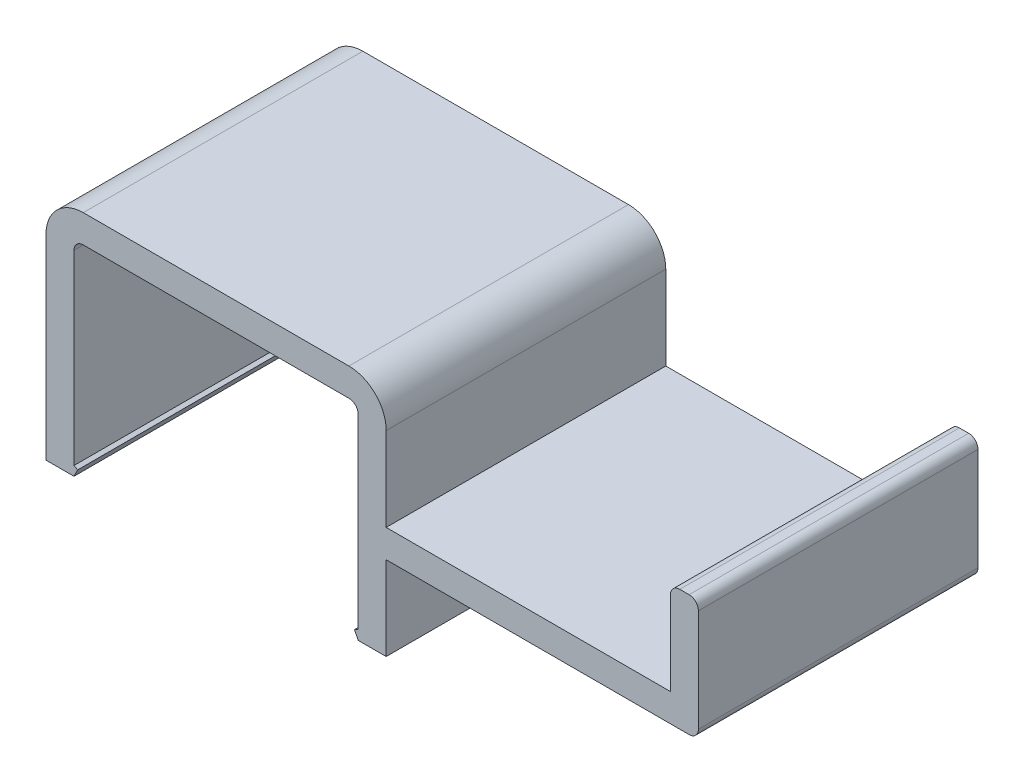
ISO-10303-21;
HEADER;
FILE_DESCRIPTION(('STEP AP214'),'2;1');
FILE_NAME('part.step','',(''),(''),'','','');
FILE_SCHEMA(('AUTOMOTIVE_DESIGN { 1 0 10303 214 1 1 1 1 }'));
ENDSEC;
DATA;
#1=APPLICATION_CONTEXT('core data for automotive mechanical design processes');
#2=APPLICATION_PROTOCOL_DEFINITION('international standard','automotive_design',2000,#1);
#3=PRODUCT_CONTEXT('',#1,'mechanical');
#4=PRODUCT('Part','Part','',(#3));
#5=PRODUCT_RELATED_PRODUCT_CATEGORY('part','',(#4));
#6=PRODUCT_DEFINITION_FORMATION('','',#4);
#7=PRODUCT_DEFINITION_CONTEXT('part definition',#1,'design');
#8=PRODUCT_DEFINITION('design','',#6,#7);
#9=PRODUCT_DEFINITION_SHAPE('','',#8);
#10=(LENGTH_UNIT() NAMED_UNIT(*) SI_UNIT(.MILLI.,.METRE.));
#11=(NAMED_UNIT(*) PLANE_ANGLE_UNIT() SI_UNIT($,.RADIAN.));
#12=(NAMED_UNIT(*) SI_UNIT($,.STERADIAN.) SOLID_ANGLE_UNIT());
#13=UNCERTAINTY_MEASURE_WITH_UNIT(LENGTH_MEASURE(1.E-05),#10,'distance_accuracy_value','');
#14=(GEOMETRIC_REPRESENTATION_CONTEXT(3) GLOBAL_UNCERTAINTY_ASSIGNED_CONTEXT((#13)) GLOBAL_UNIT_ASSIGNED_CONTEXT((#10,
#11,#12)) REPRESENTATION_CONTEXT('',''));
#15=CARTESIAN_POINT('',(0.,0.,0.));
#16=DIRECTION('',(0.,0.,1.));
#17=DIRECTION('',(1.,0.,0.));
#18=AXIS2_PLACEMENT_3D('',#15,#16,#17);
#19=CARTESIAN_POINT('',(18.5,7.5,30.));
#20=DIRECTION('',(-1.,0.,0.));
#21=DIRECTION('',(0.,-1.,0.));
#22=AXIS2_PLACEMENT_3D('',#19,#20,#21);
#23=PLANE('',#22);
#24=DIRECTION('',(0.,0.,-1.));
#25=VECTOR('',#24,1.);
#26=CARTESIAN_POINT('',(18.5,-4.5,30.));
#27=LINE('',#26,#25);
#28=CARTESIAN_POINT('',(18.5,-4.5,30.));
#29=VERTEX_POINT('',#28);
#30=CARTESIAN_POINT('',(18.5,-4.5,0.));
#31=VERTEX_POINT('',#30);
#32=EDGE_CURVE('E64',#29,#31,#27,.T.);
#33=ORIENTED_EDGE('',*,*,#32,.F.);
#34=DIRECTION('',(0.,1.,0.));
#35=VECTOR('',#34,1.);
#36=CARTESIAN_POINT('',(18.5,7.5,30.));
#37=LINE('',#36,#35);
#38=CARTESIAN_POINT('',(18.5,-13.5,30.));
#39=VERTEX_POINT('',#38);
#40=EDGE_CURVE('E353',#39,#29,#37,.T.);
#41=ORIENTED_EDGE('',*,*,#40,.F.);
#42=DIRECTION('',(0.,0.,1.));
#43=VECTOR('',#42,1.);
#44=CARTESIAN_POINT('',(18.5,-13.5,0.));
#45=LINE('',#44,#43);
#46=CARTESIAN_POINT('',(18.5,-13.5,0.));
#47=VERTEX_POINT('',#46);
#48=EDGE_CURVE('E217',#47,#39,#45,.T.);
#49=ORIENTED_EDGE('',*,*,#48,.F.);
#50=DIRECTION('',(0.,1.,0.));
#51=VECTOR('',#50,1.);
#52=CARTESIAN_POINT('',(18.5,7.5,0.));
#53=LINE('',#52,#51);
#54=EDGE_CURVE('E379',#47,#31,#53,.T.);
#55=ORIENTED_EDGE('',*,*,#54,.T.);
#56=EDGE_LOOP('',(#33,#41,#49,#55));
#57=FACE_BOUND('',#56,.T.);
#58=ADVANCED_FACE('F41',(#57),#23,.F.);
#59=CARTESIAN_POINT('',(-18.,7.49999999999999,30.));
#60=DIRECTION('',(1.,0.,0.));
#61=DIRECTION('',(0.,1.,0.));
#62=AXIS2_PLACEMENT_3D('',#59,#60,#61);
#63=PLANE('',#62);
#64=DIRECTION('',(0.,-1.,0.));
#65=VECTOR('',#64,1.);
#66=CARTESIAN_POINT('',(-18.,7.49999999999999,0.));
#67=LINE('',#66,#65);
#68=CARTESIAN_POINT('',(-18.,7.49999999999999,0.));
#69=VERTEX_POINT('',#68);
#70=CARTESIAN_POINT('',(-18.,-13.5,0.));
#71=VERTEX_POINT('',#70);
#72=EDGE_CURVE('E330',#69,#71,#67,.T.);
#73=ORIENTED_EDGE('',*,*,#72,.T.);
#74=DIRECTION('',(0.,0.,1.));
#75=VECTOR('',#74,1.);
#76=CARTESIAN_POINT('',(-18.,-13.5,0.));
#77=LINE('',#76,#75);
#78=CARTESIAN_POINT('',(-18.,-13.5,30.));
#79=VERTEX_POINT('',#78);
#80=EDGE_CURVE('E320',#71,#79,#77,.T.);
#81=ORIENTED_EDGE('',*,*,#80,.T.);
#82=DIRECTION('',(0.,-1.,0.));
#83=VECTOR('',#82,1.);
#84=CARTESIAN_POINT('',(-18.,7.49999999999999,30.));
#85=LINE('',#84,#83);
#86=CARTESIAN_POINT('',(-18.,7.49999999999999,30.));
#87=VERTEX_POINT('',#86);
#88=EDGE_CURVE('E335',#87,#79,#85,.T.);
#89=ORIENTED_EDGE('',*,*,#88,.F.);
#90=DIRECTION('',(0.,0.,-1.));
#91=VECTOR('',#90,1.);
#92=CARTESIAN_POINT('',(-18.,7.49999999999999,30.));
#93=LINE('',#92,#91);
#94=EDGE_CURVE('E361',#87,#69,#93,.T.);
#95=ORIENTED_EDGE('',*,*,#94,.T.);
#96=EDGE_LOOP('',(#73,#81,#89,#95));
#97=FACE_BOUND('',#96,.T.);
#98=ADVANCED_FACE('F43',(#97),#63,.F.);
#99=CARTESIAN_POINT('',(-15.,7.49999999999999,30.));
#100=DIRECTION('',(1.,0.,0.));
#101=DIRECTION('',(0.,1.,0.));
#102=AXIS2_PLACEMENT_3D('',#99,#100,#101);
#103=PLANE('',#102);
#104=DIRECTION('',(0.,-1.,0.));
#105=VECTOR('',#104,1.);
#106=CARTESIAN_POINT('',(-15.,7.49999999999999,0.));
#107=LINE('',#106,#105);
#108=CARTESIAN_POINT('',(-15.,7.49999999999999,0.));
#109=VERTEX_POINT('',#108);
#110=CARTESIAN_POINT('',(-15.,-12.5,0.));
#111=VERTEX_POINT('',#110);
#112=EDGE_CURVE('E363',#109,#111,#107,.T.);
#113=ORIENTED_EDGE('',*,*,#112,.F.);
#114=DIRECTION('',(0.,0.,-1.));
#115=VECTOR('',#114,1.);
#116=CARTESIAN_POINT('',(-15.,7.49999999999999,30.));
#117=LINE('',#116,#115);
#118=CARTESIAN_POINT('',(-15.,7.49999999999999,30.));
#119=VERTEX_POINT('',#118);
#120=EDGE_CURVE('E49',#119,#109,#117,.T.);
#121=ORIENTED_EDGE('',*,*,#120,.F.);
#122=DIRECTION('',(0.,-1.,0.));
#123=VECTOR('',#122,1.);
#124=CARTESIAN_POINT('',(-15.,7.49999999999999,30.));
#125=LINE('',#124,#123);
#126=CARTESIAN_POINT('',(-15.,-12.5,30.));
#127=VERTEX_POINT('',#126);
#128=EDGE_CURVE('E337',#119,#127,#125,.T.);
#129=ORIENTED_EDGE('',*,*,#128,.T.);
#130=DIRECTION('',(0.,0.,-1.));
#131=VECTOR('',#130,1.);
#132=CARTESIAN_POINT('',(-15.,-12.5,30.));
#133=LINE('',#132,#131);
#134=EDGE_CURVE('E11',#127,#111,#133,.T.);
#135=ORIENTED_EDGE('',*,*,#134,.T.);
#136=EDGE_LOOP('',(#113,#121,#129,#135));
#137=FACE_BOUND('',#136,.T.);
#138=ADVANCED_FACE('F412',(#137),#103,.T.);
#139=CARTESIAN_POINT('',(-14.,7.5,30.));
#140=DIRECTION('',(0.,0.,-1.));
#141=DIRECTION('',(-1.,0.,0.));
#142=AXIS2_PLACEMENT_3D('',#139,#140,#141);
#143=CYLINDRICAL_SURFACE('',#142,0.999999999999999);
#144=CARTESIAN_POINT('',(-14.,7.5,0.));
#145=DIRECTION('',(0.,0.,1.));
#146=DIRECTION('',(1.,0.,0.));
#147=AXIS2_PLACEMENT_3D('',#144,#145,#146);
#148=CIRCLE('',#147,0.999999999999999);
#149=CARTESIAN_POINT('',(-14.,8.5,0.));
#150=VERTEX_POINT('',#149);
#151=EDGE_CURVE('E366',#150,#109,#148,.T.);
#152=ORIENTED_EDGE('',*,*,#151,.F.);
#153=DIRECTION('',(0.,0.,-1.));
#154=VECTOR('',#153,1.);
#155=CARTESIAN_POINT('',(-14.,8.5,30.));
#156=LINE('',#155,#154);
#157=CARTESIAN_POINT('',(-14.,8.5,30.));
#158=VERTEX_POINT('',#157);
#159=EDGE_CURVE('E404',#158,#150,#156,.T.);
#160=ORIENTED_EDGE('',*,*,#159,.F.);
#161=CARTESIAN_POINT('',(-14.,7.5,30.));
#162=DIRECTION('',(0.,0.,1.));
#163=DIRECTION('',(1.,0.,0.));
#164=AXIS2_PLACEMENT_3D('',#161,#162,#163);
#165=CIRCLE('',#164,0.999999999999999);
#166=EDGE_CURVE('E341',#158,#119,#165,.T.);
#167=ORIENTED_EDGE('',*,*,#166,.T.);
#168=ORIENTED_EDGE('',*,*,#120,.T.);
#169=EDGE_LOOP('',(#152,#160,#167,#168));
#170=FACE_BOUND('',#169,.T.);
#171=ADVANCED_FACE('F408',(#170),#143,.F.);
#172=CARTESIAN_POINT('',(-14.,8.5,30.));
#173=DIRECTION('',(0.,-1.,0.));
#174=DIRECTION('',(1.,0.,0.));
#175=AXIS2_PLACEMENT_3D('',#172,#173,#174);
#176=PLANE('',#175);
#177=DIRECTION('',(-1.,0.,0.));
#178=VECTOR('',#177,1.);
#179=CARTESIAN_POINT('',(-14.,8.5,0.));
#180=LINE('',#179,#178);
#181=CARTESIAN_POINT('',(14.5,8.5,0.));
#182=VERTEX_POINT('',#181);
#183=EDGE_CURVE('E369',#182,#150,#180,.T.);
#184=ORIENTED_EDGE('',*,*,#183,.F.);
#185=DIRECTION('',(0.,0.,-1.));
#186=VECTOR('',#185,1.);
#187=CARTESIAN_POINT('',(14.5,8.5,30.));
#188=LINE('',#187,#186);
#189=CARTESIAN_POINT('',(14.5,8.5,30.));
#190=VERTEX_POINT('',#189);
#191=EDGE_CURVE('E402',#190,#182,#188,.T.);
#192=ORIENTED_EDGE('',*,*,#191,.F.);
#193=DIRECTION('',(-1.,0.,0.));
#194=VECTOR('',#193,1.);
#195=CARTESIAN_POINT('',(-14.,8.5,30.));
#196=LINE('',#195,#194);
#197=EDGE_CURVE('E344',#190,#158,#196,.T.);
#198=ORIENTED_EDGE('',*,*,#197,.T.);
#199=ORIENTED_EDGE('',*,*,#159,.T.);
#200=EDGE_LOOP('',(#184,#192,#198,#199));
#201=FACE_BOUND('',#200,.T.);
#202=ADVANCED_FACE('F417',(#201),#176,.T.);
#203=CARTESIAN_POINT('',(14.5,7.5,30.));
#204=DIRECTION('',(0.,0.,-1.));
#205=DIRECTION('',(-1.,0.,0.));
#206=AXIS2_PLACEMENT_3D('',#203,#204,#205);
#207=CYLINDRICAL_SURFACE('',#206,0.999999999999999);
#208=CARTESIAN_POINT('',(14.5,7.5,0.));
#209=DIRECTION('',(0.,0.,1.));
#210=DIRECTION('',(-1.,0.,0.));
#211=AXIS2_PLACEMENT_3D('',#208,#209,#210);
#212=CIRCLE('',#211,0.999999999999999);
#213=CARTESIAN_POINT('',(15.5,7.5,0.));
#214=VERTEX_POINT('',#213);
#215=EDGE_CURVE('E372',#214,#182,#212,.T.);
#216=ORIENTED_EDGE('',*,*,#215,.F.);
#217=DIRECTION('',(0.,0.,-1.));
#218=VECTOR('',#217,1.);
#219=CARTESIAN_POINT('',(15.5,7.5,30.));
#220=LINE('',#219,#218);
#221=CARTESIAN_POINT('',(15.5,7.5,30.));
#222=VERTEX_POINT('',#221);
#223=EDGE_CURVE('E400',#222,#214,#220,.T.);
#224=ORIENTED_EDGE('',*,*,#223,.F.);
#225=CARTESIAN_POINT('',(14.5,7.5,30.));
#226=DIRECTION('',(0.,0.,1.));
#227=DIRECTION('',(-1.,0.,0.));
#228=AXIS2_PLACEMENT_3D('',#225,#226,#227);
#229=CIRCLE('',#228,0.999999999999999);
#230=EDGE_CURVE('E347',#222,#190,#229,.T.);
#231=ORIENTED_EDGE('',*,*,#230,.T.);
#232=ORIENTED_EDGE('',*,*,#191,.T.);
#233=EDGE_LOOP('',(#216,#224,#231,#232));
#234=FACE_BOUND('',#233,.T.);
#235=ADVANCED_FACE('F490',(#234),#207,.F.);
#236=CARTESIAN_POINT('',(15.5,7.5,30.));
#237=DIRECTION('',(-1.,0.,0.));
#238=DIRECTION('',(0.,-1.,0.));
#239=AXIS2_PLACEMENT_3D('',#236,#237,#238);
#240=PLANE('',#239);
#241=DIRECTION('',(0.,1.,0.));
#242=VECTOR('',#241,1.);
#243=CARTESIAN_POINT('',(15.5,7.5,0.));
#244=LINE('',#243,#242);
#245=CARTESIAN_POINT('',(15.5,-12.5,0.));
#246=VERTEX_POINT('',#245);
#247=EDGE_CURVE('E375',#246,#214,#244,.T.);
#248=ORIENTED_EDGE('',*,*,#247,.F.);
#249=DIRECTION('',(0.,0.,-1.));
#250=VECTOR('',#249,1.);
#251=CARTESIAN_POINT('',(15.5,-12.5,30.));
#252=LINE('',#251,#250);
#253=CARTESIAN_POINT('',(15.5,-12.5,30.));
#254=VERTEX_POINT('',#253);
#255=EDGE_CURVE('E397',#254,#246,#252,.T.);
#256=ORIENTED_EDGE('',*,*,#255,.F.);
#257=DIRECTION('',(0.,1.,0.));
#258=VECTOR('',#257,1.);
#259=CARTESIAN_POINT('',(15.5,7.5,30.));
#260=LINE('',#259,#258);
#261=EDGE_CURVE('E350',#254,#222,#260,.T.);
#262=ORIENTED_EDGE('',*,*,#261,.T.);
#263=ORIENTED_EDGE('',*,*,#223,.T.);
#264=EDGE_LOOP('',(#248,#256,#262,#263));
#265=FACE_BOUND('',#264,.T.);
#266=ADVANCED_FACE('F487',(#265),#240,.T.);
#267=CARTESIAN_POINT('',(18.5,-1.5,30.));
#268=VERTEX_POINT('',#267);
#269=CARTESIAN_POINT('',(18.5,7.5,30.));
#270=VERTEX_POINT('',#269);
#271=EDGE_CURVE('E56',#268,#270,#37,.T.);
#272=ORIENTED_EDGE('',*,*,#271,.F.);
#273=DIRECTION('',(0.,0.,-1.));
#274=VECTOR('',#273,1.);
#275=CARTESIAN_POINT('',(18.5,-1.5,30.));
#276=LINE('',#275,#274);
#277=CARTESIAN_POINT('',(18.5,-1.5,0.));
#278=VERTEX_POINT('',#277);
#279=EDGE_CURVE('E278',#268,#278,#276,.T.);
#280=ORIENTED_EDGE('',*,*,#279,.T.);
#281=CARTESIAN_POINT('',(18.5,7.5,0.));
#282=VERTEX_POINT('',#281);
#283=EDGE_CURVE('E378',#278,#282,#53,.T.);
#284=ORIENTED_EDGE('',*,*,#283,.T.);
#285=DIRECTION('',(0.,0.,-1.));
#286=VECTOR('',#285,1.);
#287=CARTESIAN_POINT('',(18.5,7.5,30.));
#288=LINE('',#287,#286);
#289=EDGE_CURVE('E394',#270,#282,#288,.T.);
#290=ORIENTED_EDGE('',*,*,#289,.F.);
#291=EDGE_LOOP('',(#272,#280,#284,#290));
#292=FACE_BOUND('',#291,.T.);
#293=ADVANCED_FACE('F451',(#292),#23,.F.);
#294=CARTESIAN_POINT('',(14.5,7.5,30.));
#295=DIRECTION('',(0.,0.,-1.));
#296=DIRECTION('',(-1.,0.,0.));
#297=AXIS2_PLACEMENT_3D('',#294,#295,#296);
#298=CYLINDRICAL_SURFACE('',#297,4.);
#299=CARTESIAN_POINT('',(14.5,7.5,0.));
#300=DIRECTION('',(0.,0.,1.));
#301=DIRECTION('',(1.,0.,0.));
#302=AXIS2_PLACEMENT_3D('',#299,#300,#301);
#303=CIRCLE('',#302,4.);
#304=CARTESIAN_POINT('',(14.5,11.5,0.));
#305=VERTEX_POINT('',#304);
#306=EDGE_CURVE('E381',#282,#305,#303,.T.);
#307=ORIENTED_EDGE('',*,*,#306,.T.);
#308=DIRECTION('',(0.,0.,-1.));
#309=VECTOR('',#308,1.);
#310=CARTESIAN_POINT('',(14.5,11.5,30.));
#311=LINE('',#310,#309);
#312=CARTESIAN_POINT('',(14.5,11.5,30.));
#313=VERTEX_POINT('',#312);
#314=EDGE_CURVE('E391',#313,#305,#311,.T.);
#315=ORIENTED_EDGE('',*,*,#314,.F.);
#316=CARTESIAN_POINT('',(14.5,7.5,30.));
#317=DIRECTION('',(0.,0.,1.));
#318=DIRECTION('',(1.,0.,0.));
#319=AXIS2_PLACEMENT_3D('',#316,#317,#318);
#320=CIRCLE('',#319,4.);
#321=EDGE_CURVE('E355',#270,#313,#320,.T.);
#322=ORIENTED_EDGE('',*,*,#321,.F.);
#323=ORIENTED_EDGE('',*,*,#289,.T.);
#324=EDGE_LOOP('',(#307,#315,#322,#323));
#325=FACE_BOUND('',#324,.T.);
#326=ADVANCED_FACE('F449',(#325),#298,.T.);
#327=CARTESIAN_POINT('',(-14.,11.5,30.));
#328=DIRECTION('',(0.,-1.,0.));
#329=DIRECTION('',(1.,0.,0.));
#330=AXIS2_PLACEMENT_3D('',#327,#328,#329);
#331=PLANE('',#330);
#332=DIRECTION('',(-1.,0.,0.));
#333=VECTOR('',#332,1.);
#334=CARTESIAN_POINT('',(-14.,11.5,0.));
#335=LINE('',#334,#333);
#336=CARTESIAN_POINT('',(-14.,11.5,0.));
#337=VERTEX_POINT('',#336);
#338=EDGE_CURVE('E383',#305,#337,#335,.T.);
#339=ORIENTED_EDGE('',*,*,#338,.T.);
#340=DIRECTION('',(0.,0.,-1.));
#341=VECTOR('',#340,1.);
#342=CARTESIAN_POINT('',(-14.,11.5,30.));
#343=LINE('',#342,#341);
#344=CARTESIAN_POINT('',(-14.,11.5,30.));
#345=VERTEX_POINT('',#344);
#346=EDGE_CURVE('E388',#345,#337,#343,.T.);
#347=ORIENTED_EDGE('',*,*,#346,.F.);
#348=DIRECTION('',(-1.,0.,0.));
#349=VECTOR('',#348,1.);
#350=CARTESIAN_POINT('',(-14.,11.5,30.));
#351=LINE('',#350,#349);
#352=EDGE_CURVE('E357',#313,#345,#351,.T.);
#353=ORIENTED_EDGE('',*,*,#352,.F.);
#354=ORIENTED_EDGE('',*,*,#314,.T.);
#355=EDGE_LOOP('',(#339,#347,#353,#354));
#356=FACE_BOUND('',#355,.T.);
#357=ADVANCED_FACE('F445',(#356),#331,.F.);
#358=CARTESIAN_POINT('',(-14.,7.5,30.));
#359=DIRECTION('',(0.,0.,-1.));
#360=DIRECTION('',(-1.,0.,0.));
#361=AXIS2_PLACEMENT_3D('',#358,#359,#360);
#362=CYLINDRICAL_SURFACE('',#361,4.);
#363=CARTESIAN_POINT('',(-14.,7.5,0.));
#364=DIRECTION('',(0.,0.,1.));
#365=DIRECTION('',(1.,0.,0.));
#366=AXIS2_PLACEMENT_3D('',#363,#364,#365);
#367=CIRCLE('',#366,4.);
#368=EDGE_CURVE('E338',#337,#69,#367,.T.);
#369=ORIENTED_EDGE('',*,*,#368,.T.);
#370=ORIENTED_EDGE('',*,*,#94,.F.);
#371=CARTESIAN_POINT('',(-14.,7.5,30.));
#372=DIRECTION('',(0.,0.,1.));
#373=DIRECTION('',(1.,0.,0.));
#374=AXIS2_PLACEMENT_3D('',#371,#372,#373);
#375=CIRCLE('',#374,4.);
#376=EDGE_CURVE('E359',#345,#87,#375,.T.);
#377=ORIENTED_EDGE('',*,*,#376,.F.);
#378=ORIENTED_EDGE('',*,*,#346,.T.);
#379=EDGE_LOOP('',(#369,#370,#377,#378));
#380=FACE_BOUND('',#379,.T.);
#381=ADVANCED_FACE('F441',(#380),#362,.T.);
#382=CARTESIAN_POINT('',(-14.,7.5,30.));
#383=DIRECTION('',(0.,0.,1.));
#384=DIRECTION('',(1.,0.,0.));
#385=AXIS2_PLACEMENT_3D('',#382,#383,#384);
#386=PLANE('',#385);
#387=ORIENTED_EDGE('',*,*,#88,.T.);
#388=DIRECTION('',(1.,0.,0.));
#389=VECTOR('',#388,1.);
#390=CARTESIAN_POINT('',(-15.,-13.5,30.));
#391=LINE('',#390,#389);
#392=CARTESIAN_POINT('',(-15.,-13.5,30.));
#393=VERTEX_POINT('',#392);
#394=EDGE_CURVE('E323',#79,#393,#391,.T.);
#395=ORIENTED_EDGE('',*,*,#394,.T.);
#396=DIRECTION('',(0.447213595499957,0.894427190999916,0.));
#397=VECTOR('',#396,1.);
#398=CARTESIAN_POINT('',(-15.,-13.5,30.));
#399=LINE('',#398,#397);
#400=CARTESIAN_POINT('',(-14.6,-12.7,30.));
#401=VERTEX_POINT('',#400);
#402=EDGE_CURVE('E314',#393,#401,#399,.T.);
#403=ORIENTED_EDGE('',*,*,#402,.T.);
#404=DIRECTION('',(-0.894427190999916,0.447213595499958,0.));
#405=VECTOR('',#404,1.);
#406=CARTESIAN_POINT('',(-15.,-12.5,30.));
#407=LINE('',#406,#405);
#408=EDGE_CURVE('E303',#401,#127,#407,.T.);
#409=ORIENTED_EDGE('',*,*,#408,.T.);
#410=ORIENTED_EDGE('',*,*,#128,.F.);
#411=ORIENTED_EDGE('',*,*,#166,.F.);
#412=ORIENTED_EDGE('',*,*,#197,.F.);
#413=ORIENTED_EDGE('',*,*,#230,.F.);
#414=ORIENTED_EDGE('',*,*,#261,.F.);
#415=DIRECTION('',(-0.894427190999916,-0.447213595499958,0.));
#416=VECTOR('',#415,1.);
#417=CARTESIAN_POINT('',(15.5,-12.5,30.));
#418=LINE('',#417,#416);
#419=CARTESIAN_POINT('',(15.1,-12.7,30.));
#420=VERTEX_POINT('',#419);
#421=EDGE_CURVE('E300',#254,#420,#418,.T.);
#422=ORIENTED_EDGE('',*,*,#421,.T.);
#423=DIRECTION('',(0.447213595499963,-0.894427190999913,0.));
#424=VECTOR('',#423,1.);
#425=CARTESIAN_POINT('',(15.5,-13.5,30.));
#426=LINE('',#425,#424);
#427=CARTESIAN_POINT('',(15.5,-13.5,30.));
#428=VERTEX_POINT('',#427);
#429=EDGE_CURVE('E296',#420,#428,#426,.T.);
#430=ORIENTED_EDGE('',*,*,#429,.T.);
#431=DIRECTION('',(1.,0.,0.));
#432=VECTOR('',#431,1.);
#433=CARTESIAN_POINT('',(15.5,-13.5,30.));
#434=LINE('',#433,#432);
#435=EDGE_CURVE('E293',#428,#39,#434,.T.);
#436=ORIENTED_EDGE('',*,*,#435,.T.);
#437=ORIENTED_EDGE('',*,*,#40,.T.);
#438=DIRECTION('',(-1.,0.,0.));
#439=VECTOR('',#438,1.);
#440=CARTESIAN_POINT('',(48.5,-4.49999999999999,30.));
#441=LINE('',#440,#439);
#442=CARTESIAN_POINT('',(51.,-4.49999999999999,30.));
#443=VERTEX_POINT('',#442);
#444=EDGE_CURVE('E280',#443,#29,#441,.T.);
#445=ORIENTED_EDGE('',*,*,#444,.F.);
#446=CARTESIAN_POINT('',(51.,-3.49999999999999,30.));
#447=DIRECTION('',(0.,0.,1.));
#448=DIRECTION('',(1.,0.,0.));
#449=AXIS2_PLACEMENT_3D('',#446,#447,#448);
#450=CIRCLE('',#449,1.);
#451=CARTESIAN_POINT('',(52.,-3.49999999999998,30.));
#452=VERTEX_POINT('',#451);
#453=EDGE_CURVE('E225',#443,#452,#450,.T.);
#454=ORIENTED_EDGE('',*,*,#453,.T.);
#455=DIRECTION('',(0.,1.,0.));
#456=VECTOR('',#455,1.);
#457=CARTESIAN_POINT('',(52.,-3.49999999999998,30.));
#458=LINE('',#457,#456);
#459=CARTESIAN_POINT('',(52.,7.5,30.));
#460=VERTEX_POINT('',#459);
#461=EDGE_CURVE('E254',#452,#460,#458,.T.);
#462=ORIENTED_EDGE('',*,*,#461,.T.);
#463=CARTESIAN_POINT('',(51.,7.50000000000001,30.));
#464=DIRECTION('',(0.,0.,1.));
#465=DIRECTION('',(-1.,0.,0.));
#466=AXIS2_PLACEMENT_3D('',#463,#464,#465);
#467=CIRCLE('',#466,1.);
#468=CARTESIAN_POINT('',(51.,8.50000000000001,30.));
#469=VERTEX_POINT('',#468);
#470=EDGE_CURVE('E257',#460,#469,#467,.T.);
#471=ORIENTED_EDGE('',*,*,#470,.T.);
#472=DIRECTION('',(-1.,0.,0.));
#473=VECTOR('',#472,1.);
#474=CARTESIAN_POINT('',(50.,8.50000000000001,30.));
#475=LINE('',#474,#473);
#476=CARTESIAN_POINT('',(50.,8.50000000000001,30.));
#477=VERTEX_POINT('',#476);
#478=EDGE_CURVE('E260',#469,#477,#475,.T.);
#479=ORIENTED_EDGE('',*,*,#478,.T.);
#480=CARTESIAN_POINT('',(50.,7.50000000000001,30.));
#481=DIRECTION('',(0.,0.,1.));
#482=DIRECTION('',(-1.,0.,0.));
#483=AXIS2_PLACEMENT_3D('',#480,#481,#482);
#484=CIRCLE('',#483,1.);
#485=CARTESIAN_POINT('',(49.,7.5,30.));
#486=VERTEX_POINT('',#485);
#487=EDGE_CURVE('E240',#477,#486,#484,.T.);
#488=ORIENTED_EDGE('',*,*,#487,.T.);
#489=DIRECTION('',(0.,-1.,0.));
#490=VECTOR('',#489,1.);
#491=CARTESIAN_POINT('',(49.,-1.49999999999999,30.));
#492=LINE('',#491,#490);
#493=CARTESIAN_POINT('',(49.,-1.49999999999999,30.));
#494=VERTEX_POINT('',#493);
#495=EDGE_CURVE('E235',#486,#494,#492,.T.);
#496=ORIENTED_EDGE('',*,*,#495,.T.);
#497=DIRECTION('',(-1.,0.,0.));
#498=VECTOR('',#497,1.);
#499=CARTESIAN_POINT('',(48.5,-1.49999999999999,30.));
#500=LINE('',#499,#498);
#501=EDGE_CURVE('E282',#494,#268,#500,.T.);
#502=ORIENTED_EDGE('',*,*,#501,.T.);
#503=ORIENTED_EDGE('',*,*,#271,.T.);
#504=ORIENTED_EDGE('',*,*,#321,.T.);
#505=ORIENTED_EDGE('',*,*,#352,.T.);
#506=ORIENTED_EDGE('',*,*,#376,.T.);
#507=EDGE_LOOP('',(#387,#395,#403,#409,#410,#411,#412,#413,#414,#422,#430,#436,#437,#445,#454,
#462,#471,#479,#488,#496,#502,#503,#504,#505,#506));
#508=FACE_BOUND('',#507,.T.);
#509=ADVANCED_FACE('F420',(#508),#386,.T.);
#510=CARTESIAN_POINT('',(-14.,7.5,0.));
#511=DIRECTION('',(0.,0.,1.));
#512=DIRECTION('',(1.,0.,0.));
#513=AXIS2_PLACEMENT_3D('',#510,#511,#512);
#514=PLANE('',#513);
#515=ORIENTED_EDGE('',*,*,#72,.F.);
#516=ORIENTED_EDGE('',*,*,#368,.F.);
#517=ORIENTED_EDGE('',*,*,#338,.F.);
#518=ORIENTED_EDGE('',*,*,#306,.F.);
#519=ORIENTED_EDGE('',*,*,#283,.F.);
#520=DIRECTION('',(-1.,0.,0.));
#521=VECTOR('',#520,1.);
#522=CARTESIAN_POINT('',(48.5,-1.49999999999999,0.));
#523=LINE('',#522,#521);
#524=CARTESIAN_POINT('',(49.,-1.49999999999999,0.));
#525=VERTEX_POINT('',#524);
#526=EDGE_CURVE('E218',#525,#278,#523,.T.);
#527=ORIENTED_EDGE('',*,*,#526,.F.);
#528=DIRECTION('',(0.,-1.,0.));
#529=VECTOR('',#528,1.);
#530=CARTESIAN_POINT('',(49.,-1.49999999999999,0.));
#531=LINE('',#530,#529);
#532=CARTESIAN_POINT('',(49.,7.5,0.));
#533=VERTEX_POINT('',#532);
#534=EDGE_CURVE('E227',#533,#525,#531,.T.);
#535=ORIENTED_EDGE('',*,*,#534,.F.);
#536=CARTESIAN_POINT('',(50.,7.50000000000001,0.));
#537=DIRECTION('',(0.,0.,1.));
#538=DIRECTION('',(-1.,0.,0.));
#539=AXIS2_PLACEMENT_3D('',#536,#537,#538);
#540=CIRCLE('',#539,1.);
#541=CARTESIAN_POINT('',(50.,8.50000000000001,0.));
#542=VERTEX_POINT('',#541);
#543=EDGE_CURVE('E248',#542,#533,#540,.T.);
#544=ORIENTED_EDGE('',*,*,#543,.F.);
#545=DIRECTION('',(-1.,0.,0.));
#546=VECTOR('',#545,1.);
#547=CARTESIAN_POINT('',(50.,8.50000000000001,0.));
#548=LINE('',#547,#546);
#549=CARTESIAN_POINT('',(51.,8.50000000000001,0.));
#550=VERTEX_POINT('',#549);
#551=EDGE_CURVE('E245',#550,#542,#548,.T.);
#552=ORIENTED_EDGE('',*,*,#551,.F.);
#553=CARTESIAN_POINT('',(51.,7.50000000000001,0.));
#554=DIRECTION('',(0.,0.,1.));
#555=DIRECTION('',(-1.,0.,0.));
#556=AXIS2_PLACEMENT_3D('',#553,#554,#555);
#557=CIRCLE('',#556,1.);
#558=CARTESIAN_POINT('',(52.,7.5,0.));
#559=VERTEX_POINT('',#558);
#560=EDGE_CURVE('E237',#559,#550,#557,.T.);
#561=ORIENTED_EDGE('',*,*,#560,.F.);
#562=DIRECTION('',(0.,1.,0.));
#563=VECTOR('',#562,1.);
#564=CARTESIAN_POINT('',(52.,-3.49999999999998,0.));
#565=LINE('',#564,#563);
#566=CARTESIAN_POINT('',(52.,-3.49999999999998,0.));
#567=VERTEX_POINT('',#566);
#568=EDGE_CURVE('E234',#567,#559,#565,.T.);
#569=ORIENTED_EDGE('',*,*,#568,.F.);
#570=CARTESIAN_POINT('',(51.,-3.49999999999999,0.));
#571=DIRECTION('',(0.,0.,1.));
#572=DIRECTION('',(1.,0.,0.));
#573=AXIS2_PLACEMENT_3D('',#570,#571,#572);
#574=CIRCLE('',#573,1.);
#575=CARTESIAN_POINT('',(51.,-4.49999999999999,0.));
#576=VERTEX_POINT('',#575);
#577=EDGE_CURVE('E223',#576,#567,#574,.T.);
#578=ORIENTED_EDGE('',*,*,#577,.F.);
#579=DIRECTION('',(-1.,0.,0.));
#580=VECTOR('',#579,1.);
#581=CARTESIAN_POINT('',(48.5,-4.49999999999999,0.));
#582=LINE('',#581,#580);
#583=EDGE_CURVE('E209',#576,#31,#582,.T.);
#584=ORIENTED_EDGE('',*,*,#583,.T.);
#585=ORIENTED_EDGE('',*,*,#54,.F.);
#586=DIRECTION('',(1.,0.,0.));
#587=VECTOR('',#586,1.);
#588=CARTESIAN_POINT('',(15.5,-13.5,0.));
#589=LINE('',#588,#587);
#590=CARTESIAN_POINT('',(15.5,-13.5,0.));
#591=VERTEX_POINT('',#590);
#592=EDGE_CURVE('E288',#591,#47,#589,.T.);
#593=ORIENTED_EDGE('',*,*,#592,.F.);
#594=DIRECTION('',(0.447213595499963,-0.894427190999913,0.));
#595=VECTOR('',#594,1.);
#596=CARTESIAN_POINT('',(15.5,-13.5,0.));
#597=LINE('',#596,#595);
#598=CARTESIAN_POINT('',(15.1,-12.7,0.));
#599=VERTEX_POINT('',#598);
#600=EDGE_CURVE('E306',#599,#591,#597,.T.);
#601=ORIENTED_EDGE('',*,*,#600,.F.);
#602=DIRECTION('',(-0.894427190999916,-0.447213595499958,0.));
#603=VECTOR('',#602,1.);
#604=CARTESIAN_POINT('',(15.5,-12.5,0.));
#605=LINE('',#604,#603);
#606=EDGE_CURVE('E297',#246,#599,#605,.T.);
#607=ORIENTED_EDGE('',*,*,#606,.F.);
#608=ORIENTED_EDGE('',*,*,#247,.T.);
#609=ORIENTED_EDGE('',*,*,#215,.T.);
#610=ORIENTED_EDGE('',*,*,#183,.T.);
#611=ORIENTED_EDGE('',*,*,#151,.T.);
#612=ORIENTED_EDGE('',*,*,#112,.T.);
#613=DIRECTION('',(-0.894427190999916,0.447213595499958,0.));
#614=VECTOR('',#613,1.);
#615=CARTESIAN_POINT('',(-15.,-12.5,0.));
#616=LINE('',#615,#614);
#617=CARTESIAN_POINT('',(-14.6,-12.7,0.));
#618=VERTEX_POINT('',#617);
#619=EDGE_CURVE('E311',#618,#111,#616,.T.);
#620=ORIENTED_EDGE('',*,*,#619,.F.);
#621=DIRECTION('',(0.447213595499957,0.894427190999916,0.));
#622=VECTOR('',#621,1.);
#623=CARTESIAN_POINT('',(-15.,-13.5,0.));
#624=LINE('',#623,#622);
#625=CARTESIAN_POINT('',(-15.,-13.5,0.));
#626=VERTEX_POINT('',#625);
#627=EDGE_CURVE('E317',#626,#618,#624,.T.);
#628=ORIENTED_EDGE('',*,*,#627,.F.);
#629=DIRECTION('',(1.,0.,0.));
#630=VECTOR('',#629,1.);
#631=CARTESIAN_POINT('',(-15.,-13.5,0.));
#632=LINE('',#631,#630);
#633=EDGE_CURVE('E313',#71,#626,#632,.T.);
#634=ORIENTED_EDGE('',*,*,#633,.F.);
#635=EDGE_LOOP('',(#515,#516,#517,#518,#519,#527,#535,#544,#552,#561,#569,#578,#584,#585,#593,
#601,#607,#608,#609,#610,#611,#612,#620,#628,#634));
#636=FACE_BOUND('',#635,.T.);
#637=ADVANCED_FACE('F231',(#636),#514,.F.);
#638=CARTESIAN_POINT('',(-15.,-12.5,0.));
#639=DIRECTION('',(0.447213595499958,0.894427190999916,0.));
#640=DIRECTION('',(-0.894427190999916,0.447213595499958,0.));
#641=AXIS2_PLACEMENT_3D('',#638,#639,#640);
#642=PLANE('',#641);
#643=ORIENTED_EDGE('',*,*,#408,.F.);
#644=DIRECTION('',(0.,0.,1.));
#645=VECTOR('',#644,1.);
#646=CARTESIAN_POINT('',(-14.6,-12.7,0.));
#647=LINE('',#646,#645);
#648=EDGE_CURVE('E328',#618,#401,#647,.T.);
#649=ORIENTED_EDGE('',*,*,#648,.F.);
#650=ORIENTED_EDGE('',*,*,#619,.T.);
#651=ORIENTED_EDGE('',*,*,#134,.F.);
#652=EDGE_LOOP('',(#643,#649,#650,#651));
#653=FACE_BOUND('',#652,.T.);
#654=ADVANCED_FACE('F425',(#653),#642,.T.);
#655=CARTESIAN_POINT('',(-15.,-13.5,0.));
#656=DIRECTION('',(0.894427190999916,-0.447213595499957,0.));
#657=DIRECTION('',(0.447213595499957,0.894427190999916,0.));
#658=AXIS2_PLACEMENT_3D('',#655,#656,#657);
#659=PLANE('',#658);
#660=ORIENTED_EDGE('',*,*,#402,.F.);
#661=DIRECTION('',(0.,0.,1.));
#662=VECTOR('',#661,1.);
#663=CARTESIAN_POINT('',(-15.,-13.5,0.));
#664=LINE('',#663,#662);
#665=EDGE_CURVE('E331',#626,#393,#664,.T.);
#666=ORIENTED_EDGE('',*,*,#665,.F.);
#667=ORIENTED_EDGE('',*,*,#627,.T.);
#668=ORIENTED_EDGE('',*,*,#648,.T.);
#669=EDGE_LOOP('',(#660,#666,#667,#668));
#670=FACE_BOUND('',#669,.T.);
#671=ADVANCED_FACE('F429',(#670),#659,.T.);
#672=CARTESIAN_POINT('',(-15.,-13.5,0.));
#673=DIRECTION('',(0.,-1.,0.));
#674=DIRECTION('',(0.,0.,-1.));
#675=AXIS2_PLACEMENT_3D('',#672,#673,#674);
#676=PLANE('',#675);
#677=ORIENTED_EDGE('',*,*,#394,.F.);
#678=ORIENTED_EDGE('',*,*,#80,.F.);
#679=ORIENTED_EDGE('',*,*,#633,.T.);
#680=ORIENTED_EDGE('',*,*,#665,.T.);
#681=EDGE_LOOP('',(#677,#678,#679,#680));
#682=FACE_BOUND('',#681,.T.);
#683=ADVANCED_FACE('F433',(#682),#676,.T.);
#684=CARTESIAN_POINT('',(15.5,-13.5,0.));
#685=DIRECTION('',(0.,-1.,0.));
#686=DIRECTION('',(1.,0.,0.));
#687=AXIS2_PLACEMENT_3D('',#684,#685,#686);
#688=PLANE('',#687);
#689=ORIENTED_EDGE('',*,*,#435,.F.);
#690=DIRECTION('',(0.,0.,1.));
#691=VECTOR('',#690,1.);
#692=CARTESIAN_POINT('',(15.5,-13.5,0.));
#693=LINE('',#692,#691);
#694=EDGE_CURVE('E289',#591,#428,#693,.T.);
#695=ORIENTED_EDGE('',*,*,#694,.F.);
#696=ORIENTED_EDGE('',*,*,#592,.T.);
#697=ORIENTED_EDGE('',*,*,#48,.T.);
#698=EDGE_LOOP('',(#689,#695,#696,#697));
#699=FACE_BOUND('',#698,.T.);
#700=ADVANCED_FACE('F476',(#699),#688,.T.);
#701=CARTESIAN_POINT('',(15.5,-13.5,0.));
#702=DIRECTION('',(-0.894427190999913,-0.447213595499963,0.));
#703=DIRECTION('',(0.447213595499963,-0.894427190999913,0.));
#704=AXIS2_PLACEMENT_3D('',#701,#702,#703);
#705=PLANE('',#704);
#706=ORIENTED_EDGE('',*,*,#429,.F.);
#707=DIRECTION('',(0.,0.,1.));
#708=VECTOR('',#707,1.);
#709=CARTESIAN_POINT('',(15.1,-12.7,0.));
#710=LINE('',#709,#708);
#711=EDGE_CURVE('E286',#599,#420,#710,.T.);
#712=ORIENTED_EDGE('',*,*,#711,.F.);
#713=ORIENTED_EDGE('',*,*,#600,.T.);
#714=ORIENTED_EDGE('',*,*,#694,.T.);
#715=EDGE_LOOP('',(#706,#712,#713,#714));
#716=FACE_BOUND('',#715,.T.);
#717=ADVANCED_FACE('F481',(#716),#705,.T.);
#718=CARTESIAN_POINT('',(15.5,-12.5,0.));
#719=DIRECTION('',(-0.447213595499958,0.894427190999916,0.));
#720=DIRECTION('',(-0.894427190999916,-0.447213595499958,0.));
#721=AXIS2_PLACEMENT_3D('',#718,#719,#720);
#722=PLANE('',#721);
#723=ORIENTED_EDGE('',*,*,#421,.F.);
#724=ORIENTED_EDGE('',*,*,#255,.T.);
#725=ORIENTED_EDGE('',*,*,#606,.T.);
#726=ORIENTED_EDGE('',*,*,#711,.T.);
#727=EDGE_LOOP('',(#723,#724,#725,#726));
#728=FACE_BOUND('',#727,.T.);
#729=ADVANCED_FACE('F483',(#728),#722,.T.);
#730=CARTESIAN_POINT('',(48.5,-4.49999999999999,30.));
#731=DIRECTION('',(0.,1.,0.));
#732=DIRECTION('',(-1.,0.,0.));
#733=AXIS2_PLACEMENT_3D('',#730,#731,#732);
#734=PLANE('',#733);
#735=ORIENTED_EDGE('',*,*,#32,.T.);
#736=ORIENTED_EDGE('',*,*,#583,.F.);
#737=DIRECTION('',(0.,0.,1.));
#738=VECTOR('',#737,1.);
#739=CARTESIAN_POINT('',(51.,-4.49999999999999,0.));
#740=LINE('',#739,#738);
#741=EDGE_CURVE('E213',#576,#443,#740,.T.);
#742=ORIENTED_EDGE('',*,*,#741,.T.);
#743=ORIENTED_EDGE('',*,*,#444,.T.);
#744=EDGE_LOOP('',(#735,#736,#742,#743));
#745=FACE_BOUND('',#744,.T.);
#746=ADVANCED_FACE('F211',(#745),#734,.F.);
#747=CARTESIAN_POINT('',(48.5,-1.49999999999999,30.));
#748=DIRECTION('',(0.,1.,0.));
#749=DIRECTION('',(-1.,0.,0.));
#750=AXIS2_PLACEMENT_3D('',#747,#748,#749);
#751=PLANE('',#750);
#752=ORIENTED_EDGE('',*,*,#279,.F.);
#753=ORIENTED_EDGE('',*,*,#501,.F.);
#754=DIRECTION('',(0.,0.,1.));
#755=VECTOR('',#754,1.);
#756=CARTESIAN_POINT('',(49.,-1.49999999999999,0.));
#757=LINE('',#756,#755);
#758=EDGE_CURVE('E265',#525,#494,#757,.T.);
#759=ORIENTED_EDGE('',*,*,#758,.F.);
#760=ORIENTED_EDGE('',*,*,#526,.T.);
#761=EDGE_LOOP('',(#752,#753,#759,#760));
#762=FACE_BOUND('',#761,.T.);
#763=ADVANCED_FACE('F455',(#762),#751,.T.);
#764=CARTESIAN_POINT('',(49.,-1.49999999999999,0.));
#765=DIRECTION('',(-1.,0.,0.));
#766=DIRECTION('',(0.,0.,1.));
#767=AXIS2_PLACEMENT_3D('',#764,#765,#766);
#768=PLANE('',#767);
#769=ORIENTED_EDGE('',*,*,#495,.F.);
#770=DIRECTION('',(0.,0.,1.));
#771=VECTOR('',#770,1.);
#772=CARTESIAN_POINT('',(49.,7.5,0.));
#773=LINE('',#772,#771);
#774=EDGE_CURVE('E268',#533,#486,#773,.T.);
#775=ORIENTED_EDGE('',*,*,#774,.F.);
#776=ORIENTED_EDGE('',*,*,#534,.T.);
#777=ORIENTED_EDGE('',*,*,#758,.T.);
#778=EDGE_LOOP('',(#769,#775,#776,#777));
#779=FACE_BOUND('',#778,.T.);
#780=ADVANCED_FACE('F536',(#779),#768,.T.);
#781=CARTESIAN_POINT('',(50.,7.50000000000001,0.));
#782=DIRECTION('',(0.,0.,1.));
#783=DIRECTION('',(1.,0.,0.));
#784=AXIS2_PLACEMENT_3D('',#781,#782,#783);
#785=CYLINDRICAL_SURFACE('',#784,1.);
#786=ORIENTED_EDGE('',*,*,#487,.F.);
#787=DIRECTION('',(0.,0.,1.));
#788=VECTOR('',#787,1.);
#789=CARTESIAN_POINT('',(50.,8.50000000000001,0.));
#790=LINE('',#789,#788);
#791=EDGE_CURVE('E270',#542,#477,#790,.T.);
#792=ORIENTED_EDGE('',*,*,#791,.F.);
#793=ORIENTED_EDGE('',*,*,#543,.T.);
#794=ORIENTED_EDGE('',*,*,#774,.T.);
#795=EDGE_LOOP('',(#786,#792,#793,#794));
#796=FACE_BOUND('',#795,.T.);
#797=ADVANCED_FACE('F462',(#796),#785,.T.);
#798=CARTESIAN_POINT('',(50.,8.50000000000001,0.));
#799=DIRECTION('',(0.,1.,0.));
#800=DIRECTION('',(0.,0.,1.));
#801=AXIS2_PLACEMENT_3D('',#798,#799,#800);
#802=PLANE('',#801);
#803=ORIENTED_EDGE('',*,*,#478,.F.);
#804=DIRECTION('',(0.,0.,1.));
#805=VECTOR('',#804,1.);
#806=CARTESIAN_POINT('',(51.,8.50000000000001,0.));
#807=LINE('',#806,#805);
#808=EDGE_CURVE('E272',#550,#469,#807,.T.);
#809=ORIENTED_EDGE('',*,*,#808,.F.);
#810=ORIENTED_EDGE('',*,*,#551,.T.);
#811=ORIENTED_EDGE('',*,*,#791,.T.);
#812=EDGE_LOOP('',(#803,#809,#810,#811));
#813=FACE_BOUND('',#812,.T.);
#814=ADVANCED_FACE('F466',(#813),#802,.T.);
#815=CARTESIAN_POINT('',(51.,7.50000000000001,0.));
#816=DIRECTION('',(0.,0.,1.));
#817=DIRECTION('',(1.,0.,0.));
#818=AXIS2_PLACEMENT_3D('',#815,#816,#817);
#819=CYLINDRICAL_SURFACE('',#818,1.);
#820=ORIENTED_EDGE('',*,*,#470,.F.);
#821=DIRECTION('',(0.,0.,1.));
#822=VECTOR('',#821,1.);
#823=CARTESIAN_POINT('',(52.,7.5,0.));
#824=LINE('',#823,#822);
#825=EDGE_CURVE('E274',#559,#460,#824,.T.);
#826=ORIENTED_EDGE('',*,*,#825,.F.);
#827=ORIENTED_EDGE('',*,*,#560,.T.);
#828=ORIENTED_EDGE('',*,*,#808,.T.);
#829=EDGE_LOOP('',(#820,#826,#827,#828));
#830=FACE_BOUND('',#829,.T.);
#831=ADVANCED_FACE('F469',(#830),#819,.T.);
#832=CARTESIAN_POINT('',(52.,-3.49999999999998,0.));
#833=DIRECTION('',(1.,0.,0.));
#834=DIRECTION('',(0.,0.,-1.));
#835=AXIS2_PLACEMENT_3D('',#832,#833,#834);
#836=PLANE('',#835);
#837=ORIENTED_EDGE('',*,*,#461,.F.);
#838=DIRECTION('',(0.,0.,1.));
#839=VECTOR('',#838,1.);
#840=CARTESIAN_POINT('',(52.,-3.49999999999998,0.));
#841=LINE('',#840,#839);
#842=EDGE_CURVE('E226',#567,#452,#841,.T.);
#843=ORIENTED_EDGE('',*,*,#842,.F.);
#844=ORIENTED_EDGE('',*,*,#568,.T.);
#845=ORIENTED_EDGE('',*,*,#825,.T.);
#846=EDGE_LOOP('',(#837,#843,#844,#845));
#847=FACE_BOUND('',#846,.T.);
#848=ADVANCED_FACE('F472',(#847),#836,.T.);
#849=CARTESIAN_POINT('',(51.,-3.49999999999999,0.));
#850=DIRECTION('',(0.,0.,1.));
#851=DIRECTION('',(1.,0.,0.));
#852=AXIS2_PLACEMENT_3D('',#849,#850,#851);
#853=CYLINDRICAL_SURFACE('',#852,1.);
#854=ORIENTED_EDGE('',*,*,#453,.F.);
#855=ORIENTED_EDGE('',*,*,#741,.F.);
#856=ORIENTED_EDGE('',*,*,#577,.T.);
#857=ORIENTED_EDGE('',*,*,#842,.T.);
#858=EDGE_LOOP('',(#854,#855,#856,#857));
#859=FACE_BOUND('',#858,.T.);
#860=ADVANCED_FACE('F222',(#859),#853,.T.);
#861=CLOSED_SHELL('',(#58,#98,#138,#171,#202,#235,#266,#293,#326,#357,#381,#509,#637,#654,#671,
#683,#700,#717,#729,#746,#763,#780,#797,#814,#831,#848,#860));
#862=MANIFOLD_SOLID_BREP('B2',#861);
#863=ADVANCED_BREP_SHAPE_REPRESENTATION('',(#18,#862),#14);
#864=SHAPE_DEFINITION_REPRESENTATION(#9,#863);
ENDSEC;
END-ISO-10303-21;
